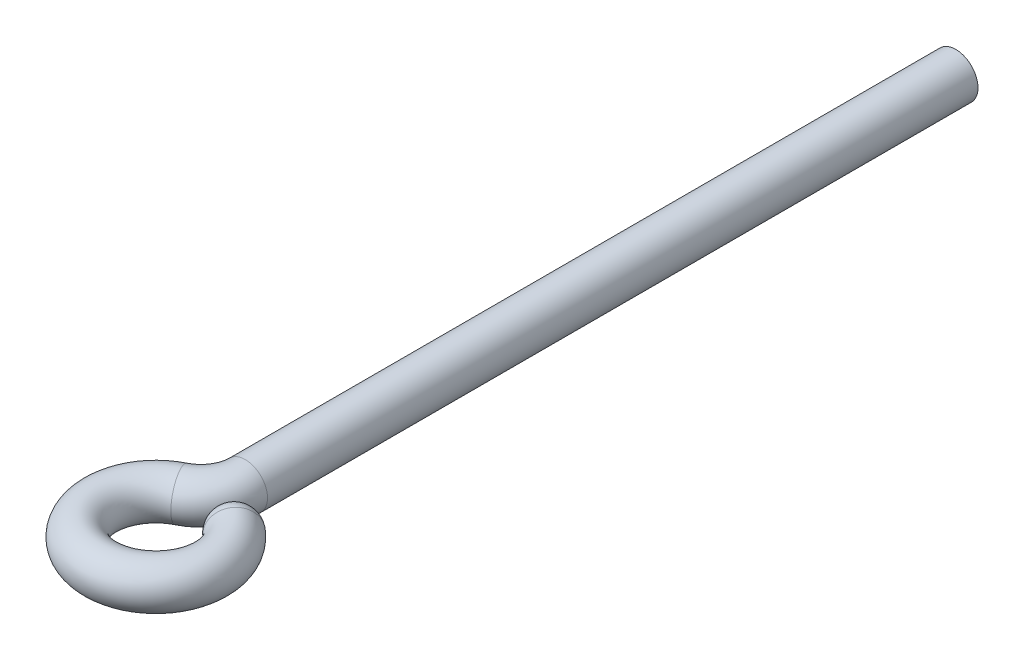
ISO-10303-21;
HEADER;
FILE_DESCRIPTION(('STEP AP214'),'2;1');
FILE_NAME('part.step','',(''),(''),'','','');
FILE_SCHEMA(('AUTOMOTIVE_DESIGN { 1 0 10303 214 1 1 1 1 }'));
ENDSEC;
DATA;
#1=APPLICATION_CONTEXT('core data for automotive mechanical design processes');
#2=APPLICATION_PROTOCOL_DEFINITION('international standard','automotive_design',2000,#1);
#3=PRODUCT_CONTEXT('',#1,'mechanical');
#4=PRODUCT('Part','Part','',(#3));
#5=PRODUCT_RELATED_PRODUCT_CATEGORY('part','',(#4));
#6=PRODUCT_DEFINITION_FORMATION('','',#4);
#7=PRODUCT_DEFINITION_CONTEXT('part definition',#1,'design');
#8=PRODUCT_DEFINITION('design','',#6,#7);
#9=PRODUCT_DEFINITION_SHAPE('','',#8);
#10=(LENGTH_UNIT() NAMED_UNIT(*) SI_UNIT(.MILLI.,.METRE.));
#11=(NAMED_UNIT(*) PLANE_ANGLE_UNIT() SI_UNIT($,.RADIAN.));
#12=(NAMED_UNIT(*) SI_UNIT($,.STERADIAN.) SOLID_ANGLE_UNIT());
#13=UNCERTAINTY_MEASURE_WITH_UNIT(LENGTH_MEASURE(1.E-05),#10,'distance_accuracy_value','');
#14=(GEOMETRIC_REPRESENTATION_CONTEXT(3) GLOBAL_UNCERTAINTY_ASSIGNED_CONTEXT((#13)) GLOBAL_UNIT_ASSIGNED_CONTEXT((#10,
#11,#12)) REPRESENTATION_CONTEXT('',''));
#15=CARTESIAN_POINT('',(0.,0.,0.));
#16=DIRECTION('',(0.,0.,1.));
#17=DIRECTION('',(1.,0.,0.));
#18=AXIS2_PLACEMENT_3D('',#15,#16,#17);
#19=CARTESIAN_POINT('',(0.,0.,-30.));
#20=DIRECTION('',(0.,0.,1.));
#21=DIRECTION('',(1.,0.,0.));
#22=AXIS2_PLACEMENT_3D('',#19,#20,#21);
#23=CYLINDRICAL_SURFACE('',#22,1.);
#24=CARTESIAN_POINT('',(0.,0.,-30.));
#25=DIRECTION('',(0.,0.,1.));
#26=DIRECTION('',(1.,0.,0.));
#27=AXIS2_PLACEMENT_3D('',#24,#25,#26);
#28=CIRCLE('',#27,1.);
#29=CARTESIAN_POINT('',(1.,0.,-30.));
#30=VERTEX_POINT('',#29);
#31=EDGE_CURVE('E11',#30,#30,#28,.T.);
#32=ORIENTED_EDGE('',*,*,#31,.T.);
#33=EDGE_LOOP('',(#32));
#34=FACE_BOUND('',#33,.T.);
#35=CARTESIAN_POINT('',(0.,0.,2.));
#36=DIRECTION('',(0.,0.,1.));
#37=DIRECTION('',(1.,0.,0.));
#38=AXIS2_PLACEMENT_3D('',#35,#36,#37);
#39=CIRCLE('',#38,1.);
#40=CARTESIAN_POINT('',(1.,0.,2.));
#41=VERTEX_POINT('',#40);
#42=EDGE_CURVE('E46',#41,#41,#39,.T.);
#43=ORIENTED_EDGE('',*,*,#42,.F.);
#44=EDGE_LOOP('',(#43));
#45=FACE_BOUND('',#44,.T.);
#46=ADVANCED_FACE('F32',(#34,#45),#23,.T.);
#47=CARTESIAN_POINT('',(0.,0.,-30.));
#48=DIRECTION('',(0.,0.,1.));
#49=DIRECTION('',(1.,0.,0.));
#50=AXIS2_PLACEMENT_3D('',#47,#48,#49);
#51=PLANE('',#50);
#52=ORIENTED_EDGE('',*,*,#31,.F.);
#53=EDGE_LOOP('',(#52));
#54=FACE_BOUND('',#53,.T.);
#55=ADVANCED_FACE('F57',(#54),#51,.F.);
#56=CARTESIAN_POINT('',(1.60696902421635,0.,4.11601776635183));
#57=DIRECTION('',(0.,0.,1.));
#58=DIRECTION('',(1.,0.,0.));
#59=AXIS2_PLACEMENT_3D('',#56,#57,#58);
#60=SPHERICAL_SURFACE('',#59,1.);
#61=CARTESIAN_POINT('',(1.60696902421635,0.,4.11601776635183));
#62=DIRECTION('',(-0.766044443118977,0.,-0.64278760968654));
#63=DIRECTION('',(-0.64278760968654,0.,0.766044443118977));
#64=AXIS2_PLACEMENT_3D('',#61,#62,#63);
#65=SPHERICAL_SURFACE('',#64,1.);
#66=CARTESIAN_POINT('',(1.60696902421635,0.,4.11601776635183));
#67=DIRECTION('',(-0.766044443118977,0.,-0.64278760968654));
#68=DIRECTION('',(-0.64278760968654,0.,0.766044443118977));
#69=AXIS2_PLACEMENT_3D('',#66,#67,#68);
#70=CIRCLE('',#69,1.);
#71=CARTESIAN_POINT('',(0.96418141452981,0.,4.88206220947081));
#72=VERTEX_POINT('',#71);
#73=EDGE_CURVE('E36',#72,#72,#70,.T.);
#74=ORIENTED_EDGE('',*,*,#73,.T.);
#75=EDGE_LOOP('',(#74));
#76=FACE_BOUND('',#75,.T.);
#77=ADVANCED_FACE('F34',(#76),#65,.T.);
#78=CARTESIAN_POINT('',(-2.,0.,2.));
#79=DIRECTION('',(0.,-1.,0.));
#80=DIRECTION('',(0.,0.,-1.));
#81=AXIS2_PLACEMENT_3D('',#78,#79,#80);
#82=TOROIDAL_SURFACE('',#81,2.,1.);
#83=CARTESIAN_POINT('',(-1.11111111111111,0.,3.79161283295523));
#84=DIRECTION('',(-0.895806416477617,0.,0.444444444444444));
#85=DIRECTION('',(0.444444444444444,0.,0.895806416477616));
#86=AXIS2_PLACEMENT_3D('',#83,#84,#85);
#87=CIRCLE('',#86,1.);
#88=CARTESIAN_POINT('',(-0.666666666666666,0.,4.68741924943285));
#89=VERTEX_POINT('',#88);
#90=EDGE_CURVE('E44',#89,#89,#87,.T.);
#91=CARTESIAN_POINT('',(-2.,0.,2.));
#92=DIRECTION('',(0.,-1.,0.));
#93=DIRECTION('',(0.,0.,-1.));
#94=AXIS2_PLACEMENT_3D('',#91,#92,#93);
#95=CIRCLE('',#94,3.);
#96=EDGE_CURVE('',#41,#89,#95,.T.);
#97=ORIENTED_EDGE('',*,*,#42,.T.);
#98=ORIENTED_EDGE('',*,*,#90,.F.);
#99=ORIENTED_EDGE('',*,*,#96,.T.);
#100=ORIENTED_EDGE('',*,*,#96,.F.);
#101=EDGE_LOOP('',(#97,#99,#98,#100));
#102=FACE_BOUND('',#101,.T.);
#103=ADVANCED_FACE('F54',(#102),#82,.T.);
#104=CARTESIAN_POINT('',(0.,0.,6.03112887414928));
#105=DIRECTION('',(0.,1.,0.));
#106=DIRECTION('',(0.,0.,1.));
#107=AXIS2_PLACEMENT_3D('',#104,#105,#106);
#108=TOROIDAL_SURFACE('',#107,2.5,1.);
#109=ORIENTED_EDGE('',*,*,#73,.F.);
#110=EDGE_LOOP('',(#109));
#111=FACE_BOUND('',#110,.T.);
#112=ORIENTED_EDGE('',*,*,#90,.T.);
#113=EDGE_LOOP('',(#112));
#114=FACE_BOUND('',#113,.T.);
#115=ADVANCED_FACE('F64',(#111,#114),#108,.T.);
#116=CLOSED_SHELL('',(#46,#55,#77,#103,#115));
#117=MANIFOLD_SOLID_BREP('B2',#116);
#118=ADVANCED_BREP_SHAPE_REPRESENTATION('',(#18,#117),#14);
#119=SHAPE_DEFINITION_REPRESENTATION(#9,#118);
ENDSEC;
END-ISO-10303-21;
